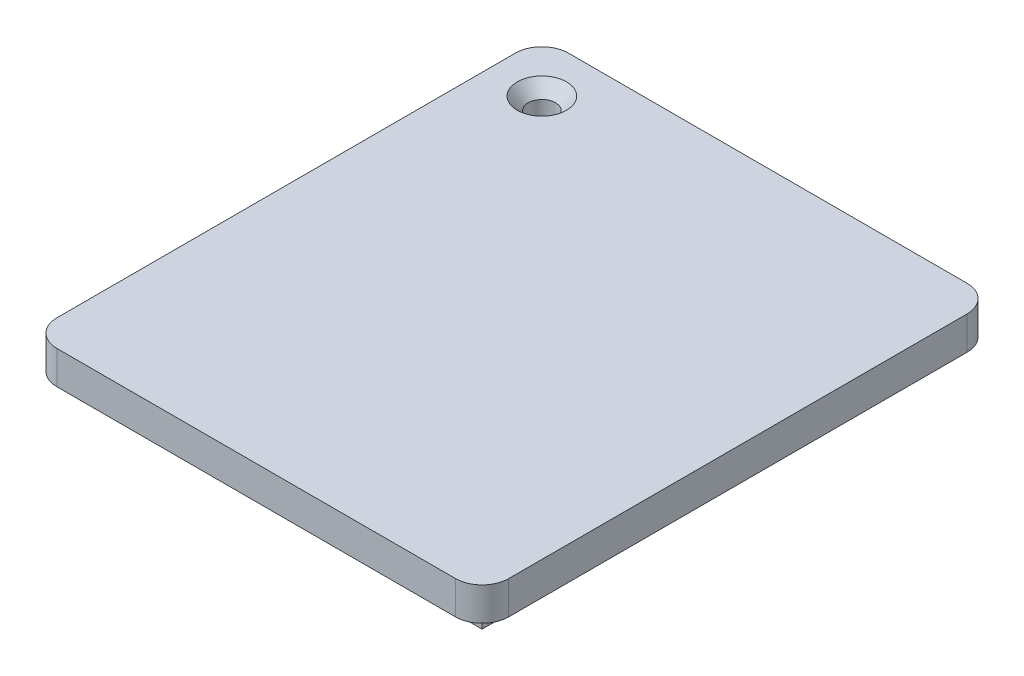
ISO-10303-21;
HEADER;
FILE_DESCRIPTION(('STEP AP214'),'2;1');
FILE_NAME('part.step','',(''),(''),'','','');
FILE_SCHEMA(('AUTOMOTIVE_DESIGN { 1 0 10303 214 1 1 1 1 }'));
ENDSEC;
DATA;
#1=APPLICATION_CONTEXT('core data for automotive mechanical design processes');
#2=APPLICATION_PROTOCOL_DEFINITION('international standard','automotive_design',2000,#1);
#3=PRODUCT_CONTEXT('',#1,'mechanical');
#4=PRODUCT('Part','Part','',(#3));
#5=PRODUCT_RELATED_PRODUCT_CATEGORY('part','',(#4));
#6=PRODUCT_DEFINITION_FORMATION('','',#4);
#7=PRODUCT_DEFINITION_CONTEXT('part definition',#1,'design');
#8=PRODUCT_DEFINITION('design','',#6,#7);
#9=PRODUCT_DEFINITION_SHAPE('','',#8);
#10=(LENGTH_UNIT() NAMED_UNIT(*) SI_UNIT(.MILLI.,.METRE.));
#11=(NAMED_UNIT(*) PLANE_ANGLE_UNIT() SI_UNIT($,.RADIAN.));
#12=(NAMED_UNIT(*) SI_UNIT($,.STERADIAN.) SOLID_ANGLE_UNIT());
#13=UNCERTAINTY_MEASURE_WITH_UNIT(LENGTH_MEASURE(1.E-05),#10,'distance_accuracy_value','');
#14=(GEOMETRIC_REPRESENTATION_CONTEXT(3) GLOBAL_UNCERTAINTY_ASSIGNED_CONTEXT((#13)) GLOBAL_UNIT_ASSIGNED_CONTEXT((#10,
#11,#12)) REPRESENTATION_CONTEXT('',''));
#15=CARTESIAN_POINT('',(0.,0.,0.));
#16=DIRECTION('',(0.,0.,1.));
#17=DIRECTION('',(1.,0.,0.));
#18=AXIS2_PLACEMENT_3D('',#15,#16,#17);
#19=CARTESIAN_POINT('',(-22.85,0.999999999999862,-37.3));
#20=DIRECTION('',(0.,-1.,0.));
#21=DIRECTION('',(1.,0.,0.));
#22=AXIS2_PLACEMENT_3D('',#19,#20,#21);
#23=PLANE('',#22);
#24=DIRECTION('',(0.,0.,-1.));
#25=VECTOR('',#24,1.);
#26=CARTESIAN_POINT('',(-22.85,0.999999999999862,-1.2));
#27=LINE('',#26,#25);
#28=CARTESIAN_POINT('',(-22.85,0.999999999999862,-1.2));
#29=VERTEX_POINT('',#28);
#30=CARTESIAN_POINT('',(-22.85,0.999999999999862,-37.3));
#31=VERTEX_POINT('',#30);
#32=EDGE_CURVE('E131',#29,#31,#27,.T.);
#33=ORIENTED_EDGE('',*,*,#32,.T.);
#34=DIRECTION('',(1.,0.,0.));
#35=VECTOR('',#34,1.);
#36=CARTESIAN_POINT('',(-22.85,0.999999999999862,-37.3));
#37=LINE('',#36,#35);
#38=CARTESIAN_POINT('',(8.75,0.999999999999972,-37.3));
#39=VERTEX_POINT('',#38);
#40=EDGE_CURVE('E120',#31,#39,#37,.T.);
#41=ORIENTED_EDGE('',*,*,#40,.T.);
#42=DIRECTION('',(0.,0.,1.));
#43=VECTOR('',#42,1.);
#44=CARTESIAN_POINT('',(8.74999999999999,0.999999999999972,-1.2));
#45=LINE('',#44,#43);
#46=CARTESIAN_POINT('',(8.74999999999999,0.999999999999972,-1.2));
#47=VERTEX_POINT('',#46);
#48=EDGE_CURVE('E130',#39,#47,#45,.T.);
#49=ORIENTED_EDGE('',*,*,#48,.T.);
#50=DIRECTION('',(-1.,0.,0.));
#51=VECTOR('',#50,1.);
#52=CARTESIAN_POINT('',(-22.85,0.999999999999862,-1.2));
#53=LINE('',#52,#51);
#54=EDGE_CURVE('E135',#47,#29,#53,.T.);
#55=ORIENTED_EDGE('',*,*,#54,.T.);
#56=EDGE_LOOP('',(#33,#41,#49,#55));
#57=FACE_BOUND('',#56,.T.);
#58=CARTESIAN_POINT('',(-20.25,0.999999999999942,-34.7));
#59=DIRECTION('',(0.,1.,0.));
#60=DIRECTION('',(0.,0.,1.));
#61=AXIS2_PLACEMENT_3D('',#58,#59,#60);
#62=CIRCLE('',#61,1.0287);
#63=CARTESIAN_POINT('',(-20.25,0.999999999999942,-33.6713));
#64=VERTEX_POINT('',#63);
#65=EDGE_CURVE('E383',#64,#64,#62,.T.);
#66=ORIENTED_EDGE('',*,*,#65,.T.);
#67=EDGE_LOOP('',(#66));
#68=FACE_BOUND('',#67,.T.);
#69=ADVANCED_FACE('F30',(#57,#68),#23,.T.);
#70=CARTESIAN_POINT('',(-24.05,1.99999999999994,-38.5));
#71=DIRECTION('',(0.,-1.,0.));
#72=DIRECTION('',(0.,0.,-1.));
#73=AXIS2_PLACEMENT_3D('',#70,#71,#72);
#74=PLANE('',#73);
#75=DIRECTION('',(0.,0.,1.));
#76=VECTOR('',#75,1.);
#77=CARTESIAN_POINT('',(-24.05,1.99999999999994,-38.5));
#78=LINE('',#77,#76);
#79=CARTESIAN_POINT('',(-24.05,1.99999999999994,-36.5));
#80=VERTEX_POINT('',#79);
#81=CARTESIAN_POINT('',(-24.05,1.99999999999994,-2.));
#82=VERTEX_POINT('',#81);
#83=EDGE_CURVE('E168',#80,#82,#78,.T.);
#84=ORIENTED_EDGE('',*,*,#83,.F.);
#85=CARTESIAN_POINT('',(-22.05,1.99999999999994,-36.5));
#86=DIRECTION('',(0.,-1.,0.));
#87=DIRECTION('',(0.,0.,-1.));
#88=AXIS2_PLACEMENT_3D('',#85,#86,#87);
#89=CIRCLE('',#88,2.);
#90=CARTESIAN_POINT('',(-22.05,1.99999999999994,-38.5));
#91=VERTEX_POINT('',#90);
#92=EDGE_CURVE('E183',#80,#91,#89,.T.);
#93=ORIENTED_EDGE('',*,*,#92,.T.);
#94=DIRECTION('',(1.,0.,0.));
#95=VECTOR('',#94,1.);
#96=CARTESIAN_POINT('',(-24.05,1.99999999999994,-38.5));
#97=LINE('',#96,#95);
#98=CARTESIAN_POINT('',(7.94999999999999,1.99999999999994,-38.5));
#99=VERTEX_POINT('',#98);
#100=EDGE_CURVE('E156',#91,#99,#97,.T.);
#101=ORIENTED_EDGE('',*,*,#100,.T.);
#102=CARTESIAN_POINT('',(7.94999999999999,1.99999999999994,-36.5));
#103=DIRECTION('',(0.,-1.,0.));
#104=DIRECTION('',(0.,0.,-1.));
#105=AXIS2_PLACEMENT_3D('',#102,#103,#104);
#106=CIRCLE('',#105,2.);
#107=CARTESIAN_POINT('',(9.94999999999999,1.99999999999994,-36.5));
#108=VERTEX_POINT('',#107);
#109=EDGE_CURVE('E181',#99,#108,#106,.T.);
#110=ORIENTED_EDGE('',*,*,#109,.T.);
#111=DIRECTION('',(0.,0.,1.));
#112=VECTOR('',#111,1.);
#113=CARTESIAN_POINT('',(9.94999999999999,1.99999999999994,-38.5));
#114=LINE('',#113,#112);
#115=CARTESIAN_POINT('',(9.94999999999999,1.99999999999994,-2.));
#116=VERTEX_POINT('',#115);
#117=EDGE_CURVE('E165',#108,#116,#114,.T.);
#118=ORIENTED_EDGE('',*,*,#117,.T.);
#119=CARTESIAN_POINT('',(7.94999999999999,1.99999999999994,-2.));
#120=DIRECTION('',(0.,-1.,0.));
#121=DIRECTION('',(0.,0.,-1.));
#122=AXIS2_PLACEMENT_3D('',#119,#120,#121);
#123=CIRCLE('',#122,2.);
#124=CARTESIAN_POINT('',(7.94999999999999,1.99999999999994,0.));
#125=VERTEX_POINT('',#124);
#126=EDGE_CURVE('E179',#116,#125,#123,.T.);
#127=ORIENTED_EDGE('',*,*,#126,.T.);
#128=DIRECTION('',(1.,0.,0.));
#129=VECTOR('',#128,1.);
#130=CARTESIAN_POINT('',(-24.05,1.99999999999994,0.));
#131=LINE('',#130,#129);
#132=CARTESIAN_POINT('',(-22.05,1.99999999999994,0.));
#133=VERTEX_POINT('',#132);
#134=EDGE_CURVE('E148',#133,#125,#131,.T.);
#135=ORIENTED_EDGE('',*,*,#134,.F.);
#136=CARTESIAN_POINT('',(-22.05,1.99999999999994,-2.));
#137=DIRECTION('',(0.,-1.,0.));
#138=DIRECTION('',(0.,0.,-1.));
#139=AXIS2_PLACEMENT_3D('',#136,#137,#138);
#140=CIRCLE('',#139,2.);
#141=EDGE_CURVE('E177',#133,#82,#140,.T.);
#142=ORIENTED_EDGE('',*,*,#141,.T.);
#143=EDGE_LOOP('',(#84,#93,#101,#110,#118,#127,#135,#142));
#144=FACE_BOUND('',#143,.T.);
#145=DIRECTION('',(1.,0.,0.));
#146=VECTOR('',#145,1.);
#147=CARTESIAN_POINT('',(-22.85,1.99999999999986,-37.3));
#148=LINE('',#147,#146);
#149=CARTESIAN_POINT('',(-22.85,1.99999999999986,-37.3));
#150=VERTEX_POINT('',#149);
#151=CARTESIAN_POINT('',(8.75,1.99999999999997,-37.3));
#152=VERTEX_POINT('',#151);
#153=EDGE_CURVE('E397',#150,#152,#148,.T.);
#154=ORIENTED_EDGE('',*,*,#153,.F.);
#155=DIRECTION('',(0.,0.,-1.));
#156=VECTOR('',#155,1.);
#157=CARTESIAN_POINT('',(-22.85,1.99999999999986,-1.2));
#158=LINE('',#157,#156);
#159=CARTESIAN_POINT('',(-22.85,1.99999999999986,-1.2));
#160=VERTEX_POINT('',#159);
#161=EDGE_CURVE('E143',#160,#150,#158,.T.);
#162=ORIENTED_EDGE('',*,*,#161,.F.);
#163=DIRECTION('',(-1.,0.,0.));
#164=VECTOR('',#163,1.);
#165=CARTESIAN_POINT('',(-22.85,1.99999999999986,-1.2));
#166=LINE('',#165,#164);
#167=CARTESIAN_POINT('',(8.74999999999999,1.99999999999994,-1.2));
#168=VERTEX_POINT('',#167);
#169=EDGE_CURVE('E139',#168,#160,#166,.T.);
#170=ORIENTED_EDGE('',*,*,#169,.F.);
#171=DIRECTION('',(0.,0.,1.));
#172=VECTOR('',#171,1.);
#173=CARTESIAN_POINT('',(8.74999999999999,1.99999999999997,-1.2));
#174=LINE('',#173,#172);
#175=EDGE_CURVE('E399',#152,#168,#174,.T.);
#176=ORIENTED_EDGE('',*,*,#175,.F.);
#177=EDGE_LOOP('',(#154,#162,#170,#176));
#178=FACE_BOUND('',#177,.T.);
#179=ADVANCED_FACE('F210',(#144,#178),#74,.T.);
#180=CARTESIAN_POINT('',(-24.05,4.49999999999994,-38.5));
#181=DIRECTION('',(0.,1.,0.));
#182=DIRECTION('',(0.,0.,1.));
#183=AXIS2_PLACEMENT_3D('',#180,#181,#182);
#184=PLANE('',#183);
#185=CARTESIAN_POINT('',(-20.25,4.49999999999994,-34.7));
#186=DIRECTION('',(0.,1.,0.));
#187=DIRECTION('',(0.,0.,1.));
#188=AXIS2_PLACEMENT_3D('',#185,#186,#187);
#189=CIRCLE('',#188,1.8542);
#190=CARTESIAN_POINT('',(-20.25,4.49999999999994,-32.8458));
#191=VERTEX_POINT('',#190);
#192=EDGE_CURVE('E387',#191,#191,#189,.T.);
#193=ORIENTED_EDGE('',*,*,#192,.F.);
#194=EDGE_LOOP('',(#193));
#195=FACE_BOUND('',#194,.T.);
#196=DIRECTION('',(-1.,0.,0.));
#197=VECTOR('',#196,1.);
#198=CARTESIAN_POINT('',(-24.05,4.49999999999994,-38.5));
#199=LINE('',#198,#197);
#200=CARTESIAN_POINT('',(7.94999999999999,4.49999999999994,-38.5));
#201=VERTEX_POINT('',#200);
#202=CARTESIAN_POINT('',(-22.05,4.49999999999994,-38.5));
#203=VERTEX_POINT('',#202);
#204=EDGE_CURVE('E153',#201,#203,#199,.T.);
#205=ORIENTED_EDGE('',*,*,#204,.T.);
#206=CARTESIAN_POINT('',(-22.05,4.49999999999994,-36.5));
#207=DIRECTION('',(0.,1.,0.));
#208=DIRECTION('',(0.,0.,1.));
#209=AXIS2_PLACEMENT_3D('',#206,#207,#208);
#210=CIRCLE('',#209,2.);
#211=CARTESIAN_POINT('',(-24.05,4.49999999999994,-36.5));
#212=VERTEX_POINT('',#211);
#213=EDGE_CURVE('E194',#203,#212,#210,.T.);
#214=ORIENTED_EDGE('',*,*,#213,.T.);
#215=DIRECTION('',(0.,0.,1.));
#216=VECTOR('',#215,1.);
#217=CARTESIAN_POINT('',(-24.05,4.49999999999994,-38.5));
#218=LINE('',#217,#216);
#219=CARTESIAN_POINT('',(-24.05,4.49999999999994,-2.));
#220=VERTEX_POINT('',#219);
#221=EDGE_CURVE('E158',#212,#220,#218,.T.);
#222=ORIENTED_EDGE('',*,*,#221,.T.);
#223=CARTESIAN_POINT('',(-22.05,4.49999999999994,-2.));
#224=DIRECTION('',(0.,1.,0.));
#225=DIRECTION('',(0.,0.,1.));
#226=AXIS2_PLACEMENT_3D('',#223,#224,#225);
#227=CIRCLE('',#226,2.);
#228=CARTESIAN_POINT('',(-22.05,4.49999999999994,0.));
#229=VERTEX_POINT('',#228);
#230=EDGE_CURVE('E189',#220,#229,#227,.T.);
#231=ORIENTED_EDGE('',*,*,#230,.T.);
#232=DIRECTION('',(-1.,0.,0.));
#233=VECTOR('',#232,1.);
#234=CARTESIAN_POINT('',(-24.05,4.49999999999994,0.));
#235=LINE('',#234,#233);
#236=CARTESIAN_POINT('',(7.94999999999999,4.49999999999994,0.));
#237=VERTEX_POINT('',#236);
#238=EDGE_CURVE('E145',#237,#229,#235,.T.);
#239=ORIENTED_EDGE('',*,*,#238,.F.);
#240=CARTESIAN_POINT('',(7.94999999999999,4.49999999999994,-2.));
#241=DIRECTION('',(0.,1.,0.));
#242=DIRECTION('',(0.,0.,1.));
#243=AXIS2_PLACEMENT_3D('',#240,#241,#242);
#244=CIRCLE('',#243,2.);
#245=CARTESIAN_POINT('',(9.94999999999999,4.49999999999994,-2.));
#246=VERTEX_POINT('',#245);
#247=EDGE_CURVE('E53',#237,#246,#244,.T.);
#248=ORIENTED_EDGE('',*,*,#247,.T.);
#249=DIRECTION('',(0.,0.,1.));
#250=VECTOR('',#249,1.);
#251=CARTESIAN_POINT('',(9.94999999999999,4.49999999999994,-38.5));
#252=LINE('',#251,#250);
#253=CARTESIAN_POINT('',(9.94999999999999,4.49999999999994,-36.5));
#254=VERTEX_POINT('',#253);
#255=EDGE_CURVE('E162',#254,#246,#252,.T.);
#256=ORIENTED_EDGE('',*,*,#255,.F.);
#257=CARTESIAN_POINT('',(7.94999999999999,4.49999999999994,-36.5));
#258=DIRECTION('',(0.,1.,0.));
#259=DIRECTION('',(0.,0.,1.));
#260=AXIS2_PLACEMENT_3D('',#257,#258,#259);
#261=CIRCLE('',#260,2.);
#262=EDGE_CURVE('E192',#254,#201,#261,.T.);
#263=ORIENTED_EDGE('',*,*,#262,.T.);
#264=EDGE_LOOP('',(#205,#214,#222,#231,#239,#248,#256,#263));
#265=FACE_BOUND('',#264,.T.);
#266=ADVANCED_FACE('F217',(#195,#265),#184,.T.);
#267=CARTESIAN_POINT('',(9.94999999999999,4.49999999999994,-38.5));
#268=DIRECTION('',(1.,0.,0.));
#269=DIRECTION('',(0.,0.,-1.));
#270=AXIS2_PLACEMENT_3D('',#267,#268,#269);
#271=PLANE('',#270);
#272=ORIENTED_EDGE('',*,*,#117,.F.);
#273=DIRECTION('',(0.,1.,0.));
#274=VECTOR('',#273,1.);
#275=CARTESIAN_POINT('',(9.94999999999999,4.49999999999994,-36.5));
#276=LINE('',#275,#274);
#277=EDGE_CURVE('E198',#108,#254,#276,.T.);
#278=ORIENTED_EDGE('',*,*,#277,.T.);
#279=ORIENTED_EDGE('',*,*,#255,.T.);
#280=DIRECTION('',(0.,1.,0.));
#281=VECTOR('',#280,1.);
#282=CARTESIAN_POINT('',(9.94999999999999,1.99999999999994,-2.));
#283=LINE('',#282,#281);
#284=EDGE_CURVE('E196',#246,#116,#283,.F.);
#285=ORIENTED_EDGE('',*,*,#284,.T.);
#286=EDGE_LOOP('',(#272,#278,#279,#285));
#287=FACE_BOUND('',#286,.T.);
#288=ADVANCED_FACE('F237',(#287),#271,.T.);
#289=CARTESIAN_POINT('',(-24.05,1.99999999999994,-38.5));
#290=DIRECTION('',(-1.,0.,0.));
#291=DIRECTION('',(0.,0.,1.));
#292=AXIS2_PLACEMENT_3D('',#289,#290,#291);
#293=PLANE('',#292);
#294=ORIENTED_EDGE('',*,*,#221,.F.);
#295=DIRECTION('',(0.,-1.,0.));
#296=VECTOR('',#295,1.);
#297=CARTESIAN_POINT('',(-24.05,1.99999999999994,-36.5));
#298=LINE('',#297,#296);
#299=EDGE_CURVE('E174',#212,#80,#298,.T.);
#300=ORIENTED_EDGE('',*,*,#299,.T.);
#301=ORIENTED_EDGE('',*,*,#83,.T.);
#302=DIRECTION('',(0.,-1.,0.));
#303=VECTOR('',#302,1.);
#304=CARTESIAN_POINT('',(-24.05,4.49999999999994,-2.));
#305=LINE('',#304,#303);
#306=EDGE_CURVE('E164',#82,#220,#305,.F.);
#307=ORIENTED_EDGE('',*,*,#306,.T.);
#308=EDGE_LOOP('',(#294,#300,#301,#307));
#309=FACE_BOUND('',#308,.T.);
#310=ADVANCED_FACE('F221',(#309),#293,.T.);
#311=CARTESIAN_POINT('',(9.94999999999999,4.49999999999994,-38.5));
#312=DIRECTION('',(0.,0.,-1.));
#313=DIRECTION('',(-1.,0.,0.));
#314=AXIS2_PLACEMENT_3D('',#311,#312,#313);
#315=PLANE('',#314);
#316=ORIENTED_EDGE('',*,*,#100,.F.);
#317=DIRECTION('',(0.,-1.,0.));
#318=VECTOR('',#317,1.);
#319=CARTESIAN_POINT('',(-22.05,4.49999999999994,-38.5));
#320=LINE('',#319,#318);
#321=EDGE_CURVE('E187',#91,#203,#320,.F.);
#322=ORIENTED_EDGE('',*,*,#321,.T.);
#323=ORIENTED_EDGE('',*,*,#204,.F.);
#324=DIRECTION('',(0.,1.,0.));
#325=VECTOR('',#324,1.);
#326=CARTESIAN_POINT('',(7.94999999999999,4.49999999999994,-38.5));
#327=LINE('',#326,#325);
#328=EDGE_CURVE('E185',#201,#99,#327,.F.);
#329=ORIENTED_EDGE('',*,*,#328,.T.);
#330=EDGE_LOOP('',(#316,#322,#323,#329));
#331=FACE_BOUND('',#330,.T.);
#332=ADVANCED_FACE('F228',(#331),#315,.T.);
#333=CARTESIAN_POINT('',(9.94999999999999,4.49999999999994,0.));
#334=DIRECTION('',(0.,0.,-1.));
#335=DIRECTION('',(-1.,0.,0.));
#336=AXIS2_PLACEMENT_3D('',#333,#334,#335);
#337=PLANE('',#336);
#338=ORIENTED_EDGE('',*,*,#134,.T.);
#339=DIRECTION('',(0.,1.,0.));
#340=VECTOR('',#339,1.);
#341=CARTESIAN_POINT('',(7.94999999999999,4.49999999999994,0.));
#342=LINE('',#341,#340);
#343=EDGE_CURVE('E11',#125,#237,#342,.T.);
#344=ORIENTED_EDGE('',*,*,#343,.T.);
#345=ORIENTED_EDGE('',*,*,#238,.T.);
#346=DIRECTION('',(0.,-1.,0.));
#347=VECTOR('',#346,1.);
#348=CARTESIAN_POINT('',(-22.05,1.99999999999994,0.));
#349=LINE('',#348,#347);
#350=EDGE_CURVE('E38',#229,#133,#349,.T.);
#351=ORIENTED_EDGE('',*,*,#350,.T.);
#352=EDGE_LOOP('',(#338,#344,#345,#351));
#353=FACE_BOUND('',#352,.T.);
#354=ADVANCED_FACE('F204',(#353),#337,.F.);
#355=CARTESIAN_POINT('',(-22.05,1.99999999999994,-36.5));
#356=DIRECTION('',(0.,-1.,0.));
#357=DIRECTION('',(0.,0.,-1.));
#358=AXIS2_PLACEMENT_3D('',#355,#356,#357);
#359=CYLINDRICAL_SURFACE('',#358,2.);
#360=ORIENTED_EDGE('',*,*,#213,.F.);
#361=ORIENTED_EDGE('',*,*,#321,.F.);
#362=ORIENTED_EDGE('',*,*,#92,.F.);
#363=ORIENTED_EDGE('',*,*,#299,.F.);
#364=EDGE_LOOP('',(#360,#361,#362,#363));
#365=FACE_BOUND('',#364,.T.);
#366=ADVANCED_FACE('F232',(#365),#359,.T.);
#367=CARTESIAN_POINT('',(7.94999999999999,4.49999999999994,-36.5));
#368=DIRECTION('',(0.,1.,0.));
#369=DIRECTION('',(0.,0.,1.));
#370=AXIS2_PLACEMENT_3D('',#367,#368,#369);
#371=CYLINDRICAL_SURFACE('',#370,2.);
#372=ORIENTED_EDGE('',*,*,#109,.F.);
#373=ORIENTED_EDGE('',*,*,#328,.F.);
#374=ORIENTED_EDGE('',*,*,#262,.F.);
#375=ORIENTED_EDGE('',*,*,#277,.F.);
#376=EDGE_LOOP('',(#372,#373,#374,#375));
#377=FACE_BOUND('',#376,.T.);
#378=ADVANCED_FACE('F234',(#377),#371,.T.);
#379=CARTESIAN_POINT('',(7.94999999999999,4.49999999999994,-2.));
#380=DIRECTION('',(0.,-1.,0.));
#381=DIRECTION('',(0.,0.,-1.));
#382=AXIS2_PLACEMENT_3D('',#379,#380,#381);
#383=CYLINDRICAL_SURFACE('',#382,2.);
#384=ORIENTED_EDGE('',*,*,#126,.F.);
#385=ORIENTED_EDGE('',*,*,#284,.F.);
#386=ORIENTED_EDGE('',*,*,#247,.F.);
#387=ORIENTED_EDGE('',*,*,#343,.F.);
#388=EDGE_LOOP('',(#384,#385,#386,#387));
#389=FACE_BOUND('',#388,.T.);
#390=ADVANCED_FACE('F216',(#389),#383,.T.);
#391=CARTESIAN_POINT('',(-22.05,4.49999999999994,-2.));
#392=DIRECTION('',(0.,1.,0.));
#393=DIRECTION('',(0.,0.,1.));
#394=AXIS2_PLACEMENT_3D('',#391,#392,#393);
#395=CYLINDRICAL_SURFACE('',#394,2.);
#396=ORIENTED_EDGE('',*,*,#230,.F.);
#397=ORIENTED_EDGE('',*,*,#306,.F.);
#398=ORIENTED_EDGE('',*,*,#141,.F.);
#399=ORIENTED_EDGE('',*,*,#350,.F.);
#400=EDGE_LOOP('',(#396,#397,#398,#399));
#401=FACE_BOUND('',#400,.T.);
#402=ADVANCED_FACE('F32',(#401),#395,.T.);
#403=CARTESIAN_POINT('',(-22.85,0.999999999999862,-1.2));
#404=DIRECTION('',(1.,0.,0.));
#405=DIRECTION('',(0.,1.,0.));
#406=AXIS2_PLACEMENT_3D('',#403,#404,#405);
#407=PLANE('',#406);
#408=ORIENTED_EDGE('',*,*,#161,.T.);
#409=DIRECTION('',(0.,1.,0.));
#410=VECTOR('',#409,1.);
#411=CARTESIAN_POINT('',(-22.85,0.999999999999862,-37.3));
#412=LINE('',#411,#410);
#413=EDGE_CURVE('E124',#31,#150,#412,.T.);
#414=ORIENTED_EDGE('',*,*,#413,.F.);
#415=ORIENTED_EDGE('',*,*,#32,.F.);
#416=DIRECTION('',(0.,1.,0.));
#417=VECTOR('',#416,1.);
#418=CARTESIAN_POINT('',(-22.85,0.999999999999862,-1.2));
#419=LINE('',#418,#417);
#420=EDGE_CURVE('E395',#29,#160,#419,.T.);
#421=ORIENTED_EDGE('',*,*,#420,.T.);
#422=EDGE_LOOP('',(#408,#414,#415,#421));
#423=FACE_BOUND('',#422,.T.);
#424=ADVANCED_FACE('F141',(#423),#407,.F.);
#425=CARTESIAN_POINT('',(-22.85,0.999999999999862,-37.3));
#426=DIRECTION('',(0.,0.,1.));
#427=DIRECTION('',(1.,0.,0.));
#428=AXIS2_PLACEMENT_3D('',#425,#426,#427);
#429=PLANE('',#428);
#430=ORIENTED_EDGE('',*,*,#153,.T.);
#431=DIRECTION('',(0.,1.,0.));
#432=VECTOR('',#431,1.);
#433=CARTESIAN_POINT('',(8.75,0.999999999999972,-37.3));
#434=LINE('',#433,#432);
#435=EDGE_CURVE('E127',#39,#152,#434,.T.);
#436=ORIENTED_EDGE('',*,*,#435,.F.);
#437=ORIENTED_EDGE('',*,*,#40,.F.);
#438=ORIENTED_EDGE('',*,*,#413,.T.);
#439=EDGE_LOOP('',(#430,#436,#437,#438));
#440=FACE_BOUND('',#439,.T.);
#441=ADVANCED_FACE('F122',(#440),#429,.F.);
#442=CARTESIAN_POINT('',(8.74999999999999,0.999999999999972,-1.2));
#443=DIRECTION('',(-1.,0.,0.));
#444=DIRECTION('',(0.,-1.,0.));
#445=AXIS2_PLACEMENT_3D('',#442,#443,#444);
#446=PLANE('',#445);
#447=ORIENTED_EDGE('',*,*,#175,.T.);
#448=DIRECTION('',(0.,1.,0.));
#449=VECTOR('',#448,1.);
#450=CARTESIAN_POINT('',(8.74999999999999,0.999999999999972,-1.2));
#451=LINE('',#450,#449);
#452=EDGE_CURVE('E45',#47,#168,#451,.T.);
#453=ORIENTED_EDGE('',*,*,#452,.F.);
#454=ORIENTED_EDGE('',*,*,#48,.F.);
#455=ORIENTED_EDGE('',*,*,#435,.T.);
#456=EDGE_LOOP('',(#447,#453,#454,#455));
#457=FACE_BOUND('',#456,.T.);
#458=ADVANCED_FACE('F261',(#457),#446,.F.);
#459=CARTESIAN_POINT('',(-22.85,0.999999999999862,-1.2));
#460=DIRECTION('',(0.,0.,-1.));
#461=DIRECTION('',(-1.,0.,0.));
#462=AXIS2_PLACEMENT_3D('',#459,#460,#461);
#463=PLANE('',#462);
#464=ORIENTED_EDGE('',*,*,#169,.T.);
#465=ORIENTED_EDGE('',*,*,#420,.F.);
#466=ORIENTED_EDGE('',*,*,#54,.F.);
#467=ORIENTED_EDGE('',*,*,#452,.T.);
#468=EDGE_LOOP('',(#464,#465,#466,#467));
#469=FACE_BOUND('',#468,.T.);
#470=ADVANCED_FACE('F258',(#469),#463,.F.);
#471=CARTESIAN_POINT('',(-20.25,4.49999999999994,-34.7));
#472=DIRECTION('',(0.,1.,0.));
#473=DIRECTION('',(0.,0.,1.));
#474=AXIS2_PLACEMENT_3D('',#471,#472,#473);
#475=CONICAL_SURFACE('',#474,1.8542,0.715584993317675);
#476=CARTESIAN_POINT('',(-20.25,3.550370879839,-34.7));
#477=DIRECTION('',(0.,1.,0.));
#478=DIRECTION('',(0.,0.,1.));
#479=AXIS2_PLACEMENT_3D('',#476,#477,#478);
#480=CIRCLE('',#479,1.0287);
#481=CARTESIAN_POINT('',(-20.25,3.550370879839,-33.6713));
#482=VERTEX_POINT('',#481);
#483=EDGE_CURVE('E386',#482,#482,#480,.T.);
#484=ORIENTED_EDGE('',*,*,#483,.F.);
#485=EDGE_LOOP('',(#484));
#486=FACE_BOUND('',#485,.T.);
#487=ORIENTED_EDGE('',*,*,#192,.T.);
#488=EDGE_LOOP('',(#487));
#489=FACE_BOUND('',#488,.T.);
#490=ADVANCED_FACE('F256',(#486,#489),#475,.F.);
#491=CARTESIAN_POINT('',(-20.25,4.49999999999994,-34.7));
#492=DIRECTION('',(0.,1.,0.));
#493=DIRECTION('',(0.,0.,1.));
#494=AXIS2_PLACEMENT_3D('',#491,#492,#493);
#495=CYLINDRICAL_SURFACE('',#494,1.0287);
#496=ORIENTED_EDGE('',*,*,#65,.F.);
#497=EDGE_LOOP('',(#496));
#498=FACE_BOUND('',#497,.T.);
#499=ORIENTED_EDGE('',*,*,#483,.T.);
#500=EDGE_LOOP('',(#499));
#501=FACE_BOUND('',#500,.T.);
#502=ADVANCED_FACE('F308',(#498,#501),#495,.F.);
#503=CLOSED_SHELL('',(#69,#179,#266,#288,#310,#332,#354,#366,#378,#390,#402,#424,#441,#458,#470,
#490,#502));
#504=MANIFOLD_SOLID_BREP('B2',#503);
#505=ADVANCED_BREP_SHAPE_REPRESENTATION('',(#18,#504),#14);
#506=SHAPE_DEFINITION_REPRESENTATION(#9,#505);
ENDSEC;
END-ISO-10303-21;
